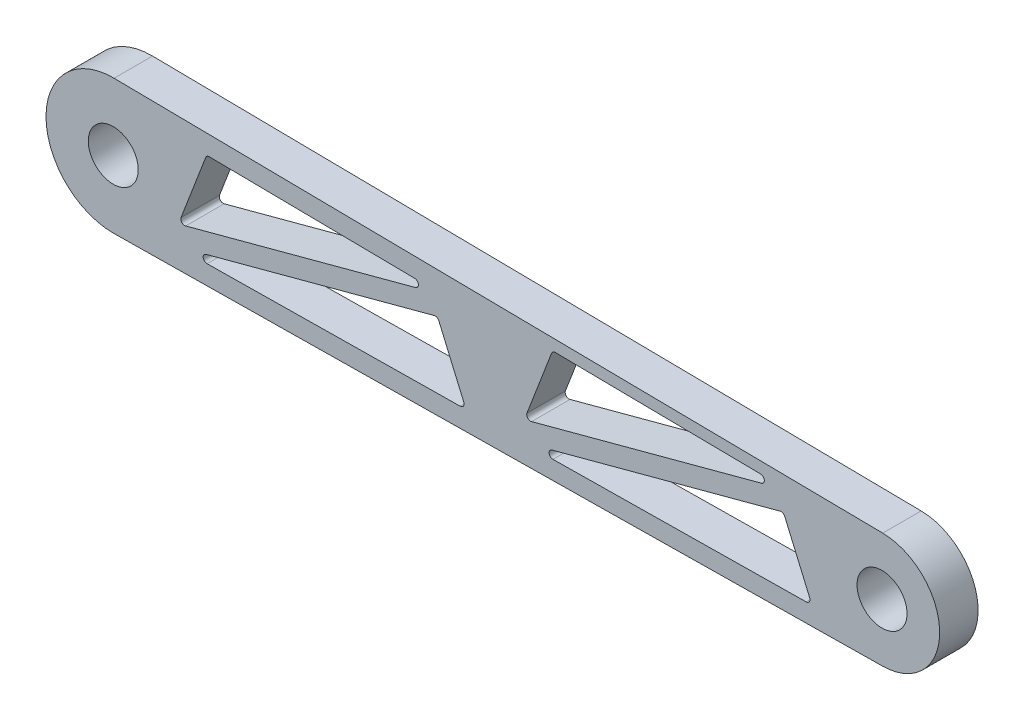
ISO-10303-21;
HEADER;
FILE_DESCRIPTION(('STEP AP214'),'2;1');
FILE_NAME('part.step','',(''),(''),'','','');
FILE_SCHEMA(('AUTOMOTIVE_DESIGN { 1 0 10303 214 1 1 1 1 }'));
ENDSEC;
DATA;
#1=APPLICATION_CONTEXT('core data for automotive mechanical design processes');
#2=APPLICATION_PROTOCOL_DEFINITION('international standard','automotive_design',2000,#1);
#3=PRODUCT_CONTEXT('',#1,'mechanical');
#4=PRODUCT('Part','Part','',(#3));
#5=PRODUCT_RELATED_PRODUCT_CATEGORY('part','',(#4));
#6=PRODUCT_DEFINITION_FORMATION('','',#4);
#7=PRODUCT_DEFINITION_CONTEXT('part definition',#1,'design');
#8=PRODUCT_DEFINITION('design','',#6,#7);
#9=PRODUCT_DEFINITION_SHAPE('','',#8);
#10=(LENGTH_UNIT() NAMED_UNIT(*) SI_UNIT(.MILLI.,.METRE.));
#11=(NAMED_UNIT(*) PLANE_ANGLE_UNIT() SI_UNIT($,.RADIAN.));
#12=(NAMED_UNIT(*) SI_UNIT($,.STERADIAN.) SOLID_ANGLE_UNIT());
#13=UNCERTAINTY_MEASURE_WITH_UNIT(LENGTH_MEASURE(1.E-05),#10,'distance_accuracy_value','');
#14=(GEOMETRIC_REPRESENTATION_CONTEXT(3) GLOBAL_UNCERTAINTY_ASSIGNED_CONTEXT((#13)) GLOBAL_UNIT_ASSIGNED_CONTEXT((#10,
#11,#12)) REPRESENTATION_CONTEXT('',''));
#15=CARTESIAN_POINT('',(0.,0.,0.));
#16=DIRECTION('',(0.,0.,1.));
#17=DIRECTION('',(1.,0.,0.));
#18=AXIS2_PLACEMENT_3D('',#15,#16,#17);
#19=CARTESIAN_POINT('',(0.,0.,10.));
#20=DIRECTION('',(0.,0.,1.));
#21=DIRECTION('',(1.,0.,0.));
#22=AXIS2_PLACEMENT_3D('',#19,#20,#21);
#23=PLANE('',#22);
#24=CARTESIAN_POINT('',(200.,0.,10.));
#25=DIRECTION('',(0.,0.,1.));
#26=DIRECTION('',(1.,0.,0.));
#27=AXIS2_PLACEMENT_3D('',#24,#25,#26);
#28=CIRCLE('',#27,6.50000000000002);
#29=CARTESIAN_POINT('',(206.5,0.,10.));
#30=VERTEX_POINT('',#29);
#31=EDGE_CURVE('E529',#30,#30,#28,.T.);
#32=ORIENTED_EDGE('',*,*,#31,.F.);
#33=EDGE_LOOP('',(#32));
#34=FACE_BOUND('',#33,.T.);
#35=CARTESIAN_POINT('',(0.,0.,10.));
#36=DIRECTION('',(0.,0.,1.));
#37=DIRECTION('',(1.,0.,0.));
#38=AXIS2_PLACEMENT_3D('',#35,#36,#37);
#39=CIRCLE('',#38,6.5);
#40=CARTESIAN_POINT('',(6.5,0.,10.));
#41=VERTEX_POINT('',#40);
#42=EDGE_CURVE('E421',#41,#41,#39,.T.);
#43=ORIENTED_EDGE('',*,*,#42,.F.);
#44=EDGE_LOOP('',(#43));
#45=FACE_BOUND('',#44,.T.);
#46=DIRECTION('',(0.999921871948004,0.0125000000000001,0.));
#47=VECTOR('',#46,1.);
#48=CARTESIAN_POINT('',(0.218750000000001,-17.4986327590901,10.));
#49=LINE('',#48,#47);
#50=CARTESIAN_POINT('',(0.21875,-17.4986327590901,10.));
#51=VERTEX_POINT('',#50);
#52=CARTESIAN_POINT('',(200.1875,-14.9988280792201,10.));
#53=VERTEX_POINT('',#52);
#54=EDGE_CURVE('E270',#51,#53,#49,.T.);
#55=ORIENTED_EDGE('',*,*,#54,.T.);
#56=CARTESIAN_POINT('',(200.,0.,10.));
#57=DIRECTION('',(0.,0.,1.));
#58=DIRECTION('',(1.,0.,0.));
#59=AXIS2_PLACEMENT_3D('',#56,#57,#58);
#60=CIRCLE('',#59,15.);
#61=CARTESIAN_POINT('',(200.1875,14.9988280792201,10.));
#62=VERTEX_POINT('',#61);
#63=EDGE_CURVE('E258',#53,#62,#60,.T.);
#64=ORIENTED_EDGE('',*,*,#63,.T.);
#65=DIRECTION('',(0.999921871948004,-0.0125000000000001,0.));
#66=VECTOR('',#65,1.);
#67=CARTESIAN_POINT('',(0.218750000000001,17.4986327590901,10.));
#68=LINE('',#67,#66);
#69=CARTESIAN_POINT('',(0.21875,17.4986327590901,10.));
#70=VERTEX_POINT('',#69);
#71=EDGE_CURVE('E269',#70,#62,#68,.T.);
#72=ORIENTED_EDGE('',*,*,#71,.F.);
#73=CARTESIAN_POINT('',(0.,0.,10.));
#74=DIRECTION('',(0.,0.,1.));
#75=DIRECTION('',(1.,0.,0.));
#76=AXIS2_PLACEMENT_3D('',#73,#74,#75);
#77=CIRCLE('',#76,17.5);
#78=EDGE_CURVE('E275',#70,#51,#77,.T.);
#79=ORIENTED_EDGE('',*,*,#78,.T.);
#80=EDGE_LOOP('',(#55,#64,#72,#79));
#81=FACE_BOUND('',#80,.T.);
#82=DIRECTION('',(0.357957296208025,0.933737957936508,0.));
#83=VECTOR('',#82,1.);
#84=CARTESIAN_POINT('',(16.9374080942747,-6.97942253213254,10.));
#85=LINE('',#84,#83);
#86=CARTESIAN_POINT('',(17.63950906089,-5.14797970423813,10.));
#87=VERTEX_POINT('',#86);
#88=CARTESIAN_POINT('',(24.039559429745,11.5466652308173,10.));
#89=VERTEX_POINT('',#88);
#90=EDGE_CURVE('E395',#87,#89,#85,.T.);
#91=ORIENTED_EDGE('',*,*,#90,.T.);
#92=CARTESIAN_POINT('',(24.9732973876815,11.1887079346093,10.));
#93=DIRECTION('',(0.,0.,1.));
#94=DIRECTION('',(1.,0.,0.));
#95=AXIS2_PLACEMENT_3D('',#92,#93,#94);
#96=CIRCLE('',#95,1.);
#97=CARTESIAN_POINT('',(24.9857973876815,12.1886298065573,10.));
#98=VERTEX_POINT('',#97);
#99=EDGE_CURVE('E384',#89,#98,#96,.F.);
#100=ORIENTED_EDGE('',*,*,#99,.T.);
#101=DIRECTION('',(0.999921871948004,-0.0125,0.));
#102=VECTOR('',#101,1.);
#103=CARTESIAN_POINT('',(24.2890019345979,12.1973404302649,10.));
#104=LINE('',#103,#102);
#105=CARTESIAN_POINT('',(78.4117048682753,11.5207537831972,10.));
#106=VERTEX_POINT('',#105);
#107=EDGE_CURVE('E404',#98,#106,#104,.T.);
#108=ORIENTED_EDGE('',*,*,#107,.T.);
#109=CARTESIAN_POINT('',(78.3992048682752,10.5208319112492,10.));
#110=DIRECTION('',(0.,0.,1.));
#111=DIRECTION('',(1.,0.,0.));
#112=AXIS2_PLACEMENT_3D('',#109,#110,#111);
#113=CIRCLE('',#112,1.);
#114=CARTESIAN_POINT('',(78.6579704622301,9.55489176435331,10.));
#115=VERTEX_POINT('',#114);
#116=EDGE_CURVE('E388',#106,#115,#113,.F.);
#117=ORIENTED_EDGE('',*,*,#116,.T.);
#118=DIRECTION('',(-0.965940146895865,-0.258765593954828,0.));
#119=VECTOR('',#118,1.);
#120=CARTESIAN_POINT('',(85.6581396306623,11.4301662712415,10.));
#121=LINE('',#120,#119);
#122=CARTESIAN_POINT('',(18.8320126127814,-6.47187714734202,10.));
#123=VERTEX_POINT('',#122);
#124=EDGE_CURVE('E396',#115,#123,#121,.T.);
#125=ORIENTED_EDGE('',*,*,#124,.T.);
#126=CARTESIAN_POINT('',(18.5732470188266,-5.50593700044615,10.));
#127=DIRECTION('',(0.,0.,1.));
#128=DIRECTION('',(1.,0.,0.));
#129=AXIS2_PLACEMENT_3D('',#126,#127,#128);
#130=CIRCLE('',#129,1.);
#131=EDGE_CURVE('E81',#123,#87,#130,.F.);
#132=ORIENTED_EDGE('',*,*,#131,.T.);
#133=EDGE_LOOP('',(#91,#100,#108,#117,#125,#132));
#134=FACE_BOUND('',#133,.T.);
#135=DIRECTION('',(-0.999921871948004,-0.0125000000000001,0.));
#136=VECTOR('',#135,1.);
#137=CARTESIAN_POINT('',(181.776483203951,-10.438596908555,10.));
#138=LINE('',#137,#136);
#139=CARTESIAN_POINT('',(180.277349255383,-10.4573375470817,10.));
#140=VERTEX_POINT('',#139);
#141=CARTESIAN_POINT('',(114.392029084728,-11.2809683978888,10.));
#142=VERTEX_POINT('',#141);
#143=EDGE_CURVE('E537',#140,#142,#138,.T.);
#144=ORIENTED_EDGE('',*,*,#143,.T.);
#145=CARTESIAN_POINT('',(114.379529084728,-10.2810465259408,10.));
#146=DIRECTION('',(0.,0.,1.));
#147=DIRECTION('',(1.,0.,0.));
#148=AXIS2_PLACEMENT_3D('',#145,#146,#147);
#149=CIRCLE('',#148,1.);
#150=CARTESIAN_POINT('',(114.120763490774,-9.31510637904495,10.));
#151=VERTEX_POINT('',#150);
#152=EDGE_CURVE('E360',#142,#151,#149,.F.);
#153=ORIENTED_EDGE('',*,*,#152,.T.);
#154=DIRECTION('',(0.965940146895865,0.258765593954827,0.));
#155=VECTOR('',#154,1.);
#156=CARTESIAN_POINT('',(106.409962250681,-11.3807520292151,10.));
#157=LINE('',#156,#155);
#158=CARTESIAN_POINT('',(173.506365503904,6.59369565871651,10.));
#159=VERTEX_POINT('',#158);
#160=EDGE_CURVE('E534',#151,#159,#157,.T.);
#161=ORIENTED_EDGE('',*,*,#160,.T.);
#162=CARTESIAN_POINT('',(173.765131097858,5.62775551182065,10.));
#163=DIRECTION('',(0.,0.,1.));
#164=DIRECTION('',(1.,0.,0.));
#165=AXIS2_PLACEMENT_3D('',#162,#163,#164);
#166=CIRCLE('',#165,1.);
#167=CARTESIAN_POINT('',(174.683510738537,6.02345594849749,10.));
#168=VERTEX_POINT('',#167);
#169=EDGE_CURVE('E348',#159,#168,#166,.F.);
#170=ORIENTED_EDGE('',*,*,#169,.T.);
#171=DIRECTION('',(0.395700436676833,-0.91837964067904,0.));
#172=VECTOR('',#171,1.);
#173=CARTESIAN_POINT('',(174.341425691282,6.81739983549119,10.));
#174=LINE('',#173,#172);
#175=CARTESIAN_POINT('',(181.183228896062,-9.06171523845684,10.));
#176=VERTEX_POINT('',#175);
#177=EDGE_CURVE('E541',#168,#176,#174,.T.);
#178=ORIENTED_EDGE('',*,*,#177,.T.);
#179=CARTESIAN_POINT('',(180.264849255383,-9.45741567513368,10.));
#180=DIRECTION('',(0.,0.,1.));
#181=DIRECTION('',(1.,0.,0.));
#182=AXIS2_PLACEMENT_3D('',#179,#180,#181);
#183=CIRCLE('',#182,1.);
#184=EDGE_CURVE('E352',#176,#140,#183,.F.);
#185=ORIENTED_EDGE('',*,*,#184,.T.);
#186=EDGE_LOOP('',(#144,#153,#161,#170,#178,#185));
#187=FACE_BOUND('',#186,.T.);
#188=DIRECTION('',(0.357957296208025,0.933737957936508,0.));
#189=VECTOR('',#188,1.);
#190=CARTESIAN_POINT('',(106.932756460314,-6.06439658972499,10.));
#191=LINE('',#190,#189);
#192=CARTESIAN_POINT('',(107.634857426929,-4.23295376183056,10.));
#193=VERTEX_POINT('',#192);
#194=CARTESIAN_POINT('',(114.034907795784,12.4616911732249,10.));
#195=VERTEX_POINT('',#194);
#196=EDGE_CURVE('E573',#193,#195,#191,.T.);
#197=ORIENTED_EDGE('',*,*,#196,.T.);
#198=CARTESIAN_POINT('',(114.968645753721,12.1037338770168,10.));
#199=DIRECTION('',(0.,0.,1.));
#200=DIRECTION('',(1.,0.,0.));
#201=AXIS2_PLACEMENT_3D('',#198,#199,#200);
#202=CIRCLE('',#201,1.);
#203=CARTESIAN_POINT('',(114.981145753721,13.1036557489648,10.));
#204=VERTEX_POINT('',#203);
#205=EDGE_CURVE('E368',#195,#204,#202,.F.);
#206=ORIENTED_EDGE('',*,*,#205,.T.);
#207=DIRECTION('',(0.999921871948004,-0.0125,0.));
#208=VECTOR('',#207,1.);
#209=CARTESIAN_POINT('',(114.284350300637,13.1123663726724,10.));
#210=LINE('',#209,#208);
#211=CARTESIAN_POINT('',(168.407053234314,12.4357797256047,10.));
#212=VERTEX_POINT('',#211);
#213=EDGE_CURVE('E570',#204,#212,#210,.T.);
#214=ORIENTED_EDGE('',*,*,#213,.T.);
#215=CARTESIAN_POINT('',(168.394553234314,11.4358578536567,10.));
#216=DIRECTION('',(0.,0.,1.));
#217=DIRECTION('',(1.,0.,0.));
#218=AXIS2_PLACEMENT_3D('',#215,#216,#217);
#219=CIRCLE('',#218,1.);
#220=CARTESIAN_POINT('',(168.653318828269,10.4699177067609,10.));
#221=VERTEX_POINT('',#220);
#222=EDGE_CURVE('E356',#212,#221,#219,.F.);
#223=ORIENTED_EDGE('',*,*,#222,.T.);
#224=DIRECTION('',(-0.965940146895865,-0.258765593954828,0.));
#225=VECTOR('',#224,1.);
#226=CARTESIAN_POINT('',(175.653487996701,12.3451922136491,10.));
#227=LINE('',#226,#225);
#228=CARTESIAN_POINT('',(108.82736097882,-5.55685120493446,10.));
#229=VERTEX_POINT('',#228);
#230=EDGE_CURVE('E565',#221,#229,#227,.T.);
#231=ORIENTED_EDGE('',*,*,#230,.T.);
#232=CARTESIAN_POINT('',(108.568595384866,-4.59091105803859,10.));
#233=DIRECTION('',(0.,0.,1.));
#234=DIRECTION('',(1.,0.,0.));
#235=AXIS2_PLACEMENT_3D('',#232,#233,#234);
#236=CIRCLE('',#235,1.);
#237=EDGE_CURVE('E364',#229,#193,#236,.F.);
#238=ORIENTED_EDGE('',*,*,#237,.T.);
#239=EDGE_LOOP('',(#197,#206,#214,#223,#231,#238));
#240=FACE_BOUND('',#239,.T.);
#241=DIRECTION('',(-0.999921871948004,-0.0125000000000001,0.));
#242=VECTOR('',#241,1.);
#243=CARTESIAN_POINT('',(91.7811348379119,-11.3536228509626,10.));
#244=LINE('',#243,#242);
#245=CARTESIAN_POINT('',(90.2820008893441,-11.3723634894892,10.));
#246=VERTEX_POINT('',#245);
#247=CARTESIAN_POINT('',(24.3966807186895,-12.1959943402964,10.));
#248=VERTEX_POINT('',#247);
#249=EDGE_CURVE('E555',#246,#248,#244,.T.);
#250=ORIENTED_EDGE('',*,*,#249,.T.);
#251=CARTESIAN_POINT('',(24.3841807186895,-11.1960724683484,10.));
#252=DIRECTION('',(0.,0.,1.));
#253=DIRECTION('',(1.,0.,0.));
#254=AXIS2_PLACEMENT_3D('',#251,#252,#253);
#255=CIRCLE('',#254,1.);
#256=CARTESIAN_POINT('',(24.1254151247346,-10.2301323214525,10.));
#257=VERTEX_POINT('',#256);
#258=EDGE_CURVE('E380',#248,#257,#255,.F.);
#259=ORIENTED_EDGE('',*,*,#258,.T.);
#260=DIRECTION('',(0.965940146895865,0.258765593954827,0.));
#261=VECTOR('',#260,1.);
#262=CARTESIAN_POINT('',(16.4146138846419,-12.2957779716227,10.));
#263=LINE('',#262,#261);
#264=CARTESIAN_POINT('',(83.5110171378645,5.67866971630896,10.));
#265=VERTEX_POINT('',#264);
#266=EDGE_CURVE('E552',#257,#265,#263,.T.);
#267=ORIENTED_EDGE('',*,*,#266,.T.);
#268=CARTESIAN_POINT('',(83.7697827318193,4.71272956941309,10.));
#269=DIRECTION('',(0.,0.,1.));
#270=DIRECTION('',(1.,0.,0.));
#271=AXIS2_PLACEMENT_3D('',#268,#269,#270);
#272=CIRCLE('',#271,1.);
#273=CARTESIAN_POINT('',(84.6881623724984,5.10843000608992,10.));
#274=VERTEX_POINT('',#273);
#275=EDGE_CURVE('E372',#265,#274,#272,.F.);
#276=ORIENTED_EDGE('',*,*,#275,.T.);
#277=DIRECTION('',(0.395700436676834,-0.91837964067904,0.));
#278=VECTOR('',#277,1.);
#279=CARTESIAN_POINT('',(84.3460773252427,5.90237389308364,10.));
#280=LINE('',#279,#278);
#281=CARTESIAN_POINT('',(91.1878805300231,-9.9767411808644,10.));
#282=VERTEX_POINT('',#281);
#283=EDGE_CURVE('E422',#274,#282,#280,.T.);
#284=ORIENTED_EDGE('',*,*,#283,.T.);
#285=CARTESIAN_POINT('',(90.2695008893441,-10.3724416175412,10.));
#286=DIRECTION('',(0.,0.,1.));
#287=DIRECTION('',(1.,0.,0.));
#288=AXIS2_PLACEMENT_3D('',#285,#286,#287);
#289=CIRCLE('',#288,1.);
#290=EDGE_CURVE('E376',#282,#246,#289,.F.);
#291=ORIENTED_EDGE('',*,*,#290,.T.);
#292=EDGE_LOOP('',(#250,#259,#267,#276,#284,#291));
#293=FACE_BOUND('',#292,.T.);
#294=ADVANCED_FACE('F73',(#34,#45,#81,#134,#187,#240,#293),#23,.T.);
#295=CARTESIAN_POINT('',(0.,0.,0.));
#296=DIRECTION('',(0.,0.,1.));
#297=DIRECTION('',(1.,0.,0.));
#298=AXIS2_PLACEMENT_3D('',#295,#296,#297);
#299=PLANE('',#298);
#300=CARTESIAN_POINT('',(200.,0.,0.));
#301=DIRECTION('',(0.,0.,1.));
#302=DIRECTION('',(1.,0.,0.));
#303=AXIS2_PLACEMENT_3D('',#300,#301,#302);
#304=CIRCLE('',#303,6.50000000000002);
#305=CARTESIAN_POINT('',(206.5,0.,0.));
#306=VERTEX_POINT('',#305);
#307=EDGE_CURVE('E527',#306,#306,#304,.T.);
#308=ORIENTED_EDGE('',*,*,#307,.T.);
#309=EDGE_LOOP('',(#308));
#310=FACE_BOUND('',#309,.T.);
#311=DIRECTION('',(-0.965940146895865,-0.258765593954828,0.));
#312=VECTOR('',#311,1.);
#313=CARTESIAN_POINT('',(175.653487996701,12.3451922136491,0.));
#314=LINE('',#313,#312);
#315=CARTESIAN_POINT('',(168.653318828269,10.4699177067609,0.));
#316=VERTEX_POINT('',#315);
#317=CARTESIAN_POINT('',(108.82736097882,-5.55685120493446,0.));
#318=VERTEX_POINT('',#317);
#319=EDGE_CURVE('E416',#316,#318,#314,.T.);
#320=ORIENTED_EDGE('',*,*,#319,.F.);
#321=CARTESIAN_POINT('',(168.394553234314,11.4358578536567,0.));
#322=DIRECTION('',(0.,0.,1.));
#323=DIRECTION('',(1.,0.,0.));
#324=AXIS2_PLACEMENT_3D('',#321,#322,#323);
#325=CIRCLE('',#324,1.);
#326=CARTESIAN_POINT('',(168.407053234314,12.4357797256047,0.));
#327=VERTEX_POINT('',#326);
#328=EDGE_CURVE('E358',#316,#327,#325,.T.);
#329=ORIENTED_EDGE('',*,*,#328,.T.);
#330=DIRECTION('',(0.999921871948004,-0.0125,0.));
#331=VECTOR('',#330,1.);
#332=CARTESIAN_POINT('',(114.284350300637,13.1123663726724,0.));
#333=LINE('',#332,#331);
#334=CARTESIAN_POINT('',(114.981145753721,13.1036557489648,0.));
#335=VERTEX_POINT('',#334);
#336=EDGE_CURVE('E544',#335,#327,#333,.T.);
#337=ORIENTED_EDGE('',*,*,#336,.F.);
#338=CARTESIAN_POINT('',(114.968645753721,12.1037338770168,0.));
#339=DIRECTION('',(0.,0.,1.));
#340=DIRECTION('',(1.,0.,0.));
#341=AXIS2_PLACEMENT_3D('',#338,#339,#340);
#342=CIRCLE('',#341,1.);
#343=CARTESIAN_POINT('',(114.034907795784,12.4616911732249,0.));
#344=VERTEX_POINT('',#343);
#345=EDGE_CURVE('E370',#335,#344,#342,.T.);
#346=ORIENTED_EDGE('',*,*,#345,.T.);
#347=DIRECTION('',(0.357957296208025,0.933737957936508,0.));
#348=VECTOR('',#347,1.);
#349=CARTESIAN_POINT('',(106.932756460314,-6.06439658972499,0.));
#350=LINE('',#349,#348);
#351=CARTESIAN_POINT('',(107.634857426929,-4.23295376183056,0.));
#352=VERTEX_POINT('',#351);
#353=EDGE_CURVE('E579',#352,#344,#350,.T.);
#354=ORIENTED_EDGE('',*,*,#353,.F.);
#355=CARTESIAN_POINT('',(108.568595384866,-4.59091105803859,0.));
#356=DIRECTION('',(0.,0.,1.));
#357=DIRECTION('',(1.,0.,0.));
#358=AXIS2_PLACEMENT_3D('',#355,#356,#357);
#359=CIRCLE('',#358,1.);
#360=EDGE_CURVE('E366',#352,#318,#359,.T.);
#361=ORIENTED_EDGE('',*,*,#360,.T.);
#362=EDGE_LOOP('',(#320,#329,#337,#346,#354,#361));
#363=FACE_BOUND('',#362,.T.);
#364=DIRECTION('',(-0.965940146895865,-0.258765593954828,0.));
#365=VECTOR('',#364,1.);
#366=CARTESIAN_POINT('',(85.6581396306623,11.4301662712415,0.));
#367=LINE('',#366,#365);
#368=CARTESIAN_POINT('',(78.6579704622301,9.55489176435331,0.));
#369=VERTEX_POINT('',#368);
#370=CARTESIAN_POINT('',(18.8320126127814,-6.47187714734202,0.));
#371=VERTEX_POINT('',#370);
#372=EDGE_CURVE('E407',#369,#371,#367,.T.);
#373=ORIENTED_EDGE('',*,*,#372,.F.);
#374=CARTESIAN_POINT('',(78.3992048682752,10.5208319112492,0.));
#375=DIRECTION('',(0.,0.,1.));
#376=DIRECTION('',(1.,0.,0.));
#377=AXIS2_PLACEMENT_3D('',#374,#375,#376);
#378=CIRCLE('',#377,1.);
#379=CARTESIAN_POINT('',(78.4117048682753,11.5207537831972,0.));
#380=VERTEX_POINT('',#379);
#381=EDGE_CURVE('E390',#369,#380,#378,.T.);
#382=ORIENTED_EDGE('',*,*,#381,.T.);
#383=DIRECTION('',(0.999921871948004,-0.0125,0.));
#384=VECTOR('',#383,1.);
#385=CARTESIAN_POINT('',(24.2890019345979,12.1973404302649,0.));
#386=LINE('',#385,#384);
#387=CARTESIAN_POINT('',(24.9857973876815,12.1886298065573,0.));
#388=VERTEX_POINT('',#387);
#389=EDGE_CURVE('E411',#388,#380,#386,.T.);
#390=ORIENTED_EDGE('',*,*,#389,.F.);
#391=CARTESIAN_POINT('',(24.9732973876815,11.1887079346093,0.));
#392=DIRECTION('',(0.,0.,1.));
#393=DIRECTION('',(1.,0.,0.));
#394=AXIS2_PLACEMENT_3D('',#391,#392,#393);
#395=CIRCLE('',#394,1.);
#396=CARTESIAN_POINT('',(24.039559429745,11.5466652308173,0.));
#397=VERTEX_POINT('',#396);
#398=EDGE_CURVE('E386',#388,#397,#395,.T.);
#399=ORIENTED_EDGE('',*,*,#398,.T.);
#400=DIRECTION('',(0.357957296208025,0.933737957936508,0.));
#401=VECTOR('',#400,1.);
#402=CARTESIAN_POINT('',(16.9374080942747,-6.97942253213254,0.));
#403=LINE('',#402,#401);
#404=CARTESIAN_POINT('',(17.63950906089,-5.14797970423813,0.));
#405=VERTEX_POINT('',#404);
#406=EDGE_CURVE('E409',#405,#397,#403,.T.);
#407=ORIENTED_EDGE('',*,*,#406,.F.);
#408=CARTESIAN_POINT('',(18.5732470188266,-5.50593700044615,0.));
#409=DIRECTION('',(0.,0.,1.));
#410=DIRECTION('',(1.,0.,0.));
#411=AXIS2_PLACEMENT_3D('',#408,#409,#410);
#412=CIRCLE('',#411,1.);
#413=EDGE_CURVE('E12',#405,#371,#412,.T.);
#414=ORIENTED_EDGE('',*,*,#413,.T.);
#415=EDGE_LOOP('',(#373,#382,#390,#399,#407,#414));
#416=FACE_BOUND('',#415,.T.);
#417=CARTESIAN_POINT('',(0.,0.,0.));
#418=DIRECTION('',(0.,0.,1.));
#419=DIRECTION('',(1.,0.,0.));
#420=AXIS2_PLACEMENT_3D('',#417,#418,#419);
#421=CIRCLE('',#420,6.5);
#422=CARTESIAN_POINT('',(6.5,0.,0.));
#423=VERTEX_POINT('',#422);
#424=EDGE_CURVE('E424',#423,#423,#421,.T.);
#425=ORIENTED_EDGE('',*,*,#424,.T.);
#426=EDGE_LOOP('',(#425));
#427=FACE_BOUND('',#426,.T.);
#428=DIRECTION('',(0.999921871948004,0.0125000000000001,0.));
#429=VECTOR('',#428,1.);
#430=CARTESIAN_POINT('',(0.218750000000001,-17.4986327590901,0.));
#431=LINE('',#430,#429);
#432=CARTESIAN_POINT('',(0.21875,-17.4986327590901,0.));
#433=VERTEX_POINT('',#432);
#434=CARTESIAN_POINT('',(200.1875,-14.9988280792201,0.));
#435=VERTEX_POINT('',#434);
#436=EDGE_CURVE('E283',#433,#435,#431,.T.);
#437=ORIENTED_EDGE('',*,*,#436,.F.);
#438=CARTESIAN_POINT('',(0.,0.,0.));
#439=DIRECTION('',(0.,0.,1.));
#440=DIRECTION('',(1.,0.,0.));
#441=AXIS2_PLACEMENT_3D('',#438,#439,#440);
#442=CIRCLE('',#441,17.5);
#443=CARTESIAN_POINT('',(0.21875,17.4986327590901,0.));
#444=VERTEX_POINT('',#443);
#445=EDGE_CURVE('E279',#444,#433,#442,.T.);
#446=ORIENTED_EDGE('',*,*,#445,.F.);
#447=DIRECTION('',(0.999921871948004,-0.0125000000000001,0.));
#448=VECTOR('',#447,1.);
#449=CARTESIAN_POINT('',(0.218750000000001,17.4986327590901,0.));
#450=LINE('',#449,#448);
#451=CARTESIAN_POINT('',(200.1875,14.9988280792201,0.));
#452=VERTEX_POINT('',#451);
#453=EDGE_CURVE('E435',#444,#452,#450,.T.);
#454=ORIENTED_EDGE('',*,*,#453,.T.);
#455=CARTESIAN_POINT('',(200.,0.,0.));
#456=DIRECTION('',(0.,0.,1.));
#457=DIRECTION('',(1.,0.,0.));
#458=AXIS2_PLACEMENT_3D('',#455,#456,#457);
#459=CIRCLE('',#458,15.);
#460=EDGE_CURVE('E433',#435,#452,#459,.T.);
#461=ORIENTED_EDGE('',*,*,#460,.F.);
#462=EDGE_LOOP('',(#437,#446,#454,#461));
#463=FACE_BOUND('',#462,.T.);
#464=DIRECTION('',(0.395700436676833,-0.91837964067904,0.));
#465=VECTOR('',#464,1.);
#466=CARTESIAN_POINT('',(174.341425691282,6.81739983549119,0.));
#467=LINE('',#466,#465);
#468=CARTESIAN_POINT('',(174.683510738537,6.02345594849749,0.));
#469=VERTEX_POINT('',#468);
#470=CARTESIAN_POINT('',(181.183228896062,-9.06171523845684,0.));
#471=VERTEX_POINT('',#470);
#472=EDGE_CURVE('E538',#469,#471,#467,.T.);
#473=ORIENTED_EDGE('',*,*,#472,.F.);
#474=CARTESIAN_POINT('',(173.765131097858,5.62775551182065,0.));
#475=DIRECTION('',(0.,0.,1.));
#476=DIRECTION('',(1.,0.,0.));
#477=AXIS2_PLACEMENT_3D('',#474,#475,#476);
#478=CIRCLE('',#477,1.);
#479=CARTESIAN_POINT('',(173.506365503904,6.59369565871651,0.));
#480=VERTEX_POINT('',#479);
#481=EDGE_CURVE('E350',#469,#480,#478,.T.);
#482=ORIENTED_EDGE('',*,*,#481,.T.);
#483=DIRECTION('',(0.965940146895865,0.258765593954827,0.));
#484=VECTOR('',#483,1.);
#485=CARTESIAN_POINT('',(106.409962250681,-11.3807520292151,0.));
#486=LINE('',#485,#484);
#487=CARTESIAN_POINT('',(114.120763490774,-9.31510637904495,0.));
#488=VERTEX_POINT('',#487);
#489=EDGE_CURVE('E531',#488,#480,#486,.T.);
#490=ORIENTED_EDGE('',*,*,#489,.F.);
#491=CARTESIAN_POINT('',(114.379529084728,-10.2810465259408,0.));
#492=DIRECTION('',(0.,0.,1.));
#493=DIRECTION('',(1.,0.,0.));
#494=AXIS2_PLACEMENT_3D('',#491,#492,#493);
#495=CIRCLE('',#494,1.);
#496=CARTESIAN_POINT('',(114.392029084728,-11.2809683978888,0.));
#497=VERTEX_POINT('',#496);
#498=EDGE_CURVE('E362',#488,#497,#495,.T.);
#499=ORIENTED_EDGE('',*,*,#498,.T.);
#500=DIRECTION('',(-0.999921871948004,-0.0125000000000001,0.));
#501=VECTOR('',#500,1.);
#502=CARTESIAN_POINT('',(181.776483203951,-10.438596908555,0.));
#503=LINE('',#502,#501);
#504=CARTESIAN_POINT('',(180.277349255383,-10.4573375470817,0.));
#505=VERTEX_POINT('',#504);
#506=EDGE_CURVE('E547',#505,#497,#503,.T.);
#507=ORIENTED_EDGE('',*,*,#506,.F.);
#508=CARTESIAN_POINT('',(180.264849255383,-9.45741567513368,0.));
#509=DIRECTION('',(0.,0.,1.));
#510=DIRECTION('',(1.,0.,0.));
#511=AXIS2_PLACEMENT_3D('',#508,#509,#510);
#512=CIRCLE('',#511,1.);
#513=EDGE_CURVE('E354',#505,#471,#512,.T.);
#514=ORIENTED_EDGE('',*,*,#513,.T.);
#515=EDGE_LOOP('',(#473,#482,#490,#499,#507,#514));
#516=FACE_BOUND('',#515,.T.);
#517=DIRECTION('',(0.395700436676834,-0.91837964067904,0.));
#518=VECTOR('',#517,1.);
#519=CARTESIAN_POINT('',(84.3460773252427,5.90237389308364,0.));
#520=LINE('',#519,#518);
#521=CARTESIAN_POINT('',(84.6881623724984,5.10843000608992,0.));
#522=VERTEX_POINT('',#521);
#523=CARTESIAN_POINT('',(91.1878805300231,-9.9767411808644,0.));
#524=VERTEX_POINT('',#523);
#525=EDGE_CURVE('E556',#522,#524,#520,.T.);
#526=ORIENTED_EDGE('',*,*,#525,.F.);
#527=CARTESIAN_POINT('',(83.7697827318193,4.71272956941309,0.));
#528=DIRECTION('',(0.,0.,1.));
#529=DIRECTION('',(1.,0.,0.));
#530=AXIS2_PLACEMENT_3D('',#527,#528,#529);
#531=CIRCLE('',#530,1.);
#532=CARTESIAN_POINT('',(83.5110171378645,5.67866971630896,0.));
#533=VERTEX_POINT('',#532);
#534=EDGE_CURVE('E374',#522,#533,#531,.T.);
#535=ORIENTED_EDGE('',*,*,#534,.T.);
#536=DIRECTION('',(0.965940146895865,0.258765593954827,0.));
#537=VECTOR('',#536,1.);
#538=CARTESIAN_POINT('',(16.4146138846419,-12.2957779716227,0.));
#539=LINE('',#538,#537);
#540=CARTESIAN_POINT('',(24.1254151247346,-10.2301323214525,0.));
#541=VERTEX_POINT('',#540);
#542=EDGE_CURVE('E561',#541,#533,#539,.T.);
#543=ORIENTED_EDGE('',*,*,#542,.F.);
#544=CARTESIAN_POINT('',(24.3841807186895,-11.1960724683484,0.));
#545=DIRECTION('',(0.,0.,1.));
#546=DIRECTION('',(1.,0.,0.));
#547=AXIS2_PLACEMENT_3D('',#544,#545,#546);
#548=CIRCLE('',#547,1.);
#549=CARTESIAN_POINT('',(24.3966807186895,-12.1959943402964,0.));
#550=VERTEX_POINT('',#549);
#551=EDGE_CURVE('E382',#541,#550,#548,.T.);
#552=ORIENTED_EDGE('',*,*,#551,.T.);
#553=DIRECTION('',(-0.999921871948004,-0.0125000000000001,0.));
#554=VECTOR('',#553,1.);
#555=CARTESIAN_POINT('',(91.7811348379119,-11.3536228509626,0.));
#556=LINE('',#555,#554);
#557=CARTESIAN_POINT('',(90.2820008893441,-11.3723634894892,0.));
#558=VERTEX_POINT('',#557);
#559=EDGE_CURVE('E564',#558,#550,#556,.T.);
#560=ORIENTED_EDGE('',*,*,#559,.F.);
#561=CARTESIAN_POINT('',(90.2695008893441,-10.3724416175412,0.));
#562=DIRECTION('',(0.,0.,1.));
#563=DIRECTION('',(1.,0.,0.));
#564=AXIS2_PLACEMENT_3D('',#561,#562,#563);
#565=CIRCLE('',#564,1.);
#566=EDGE_CURVE('E378',#558,#524,#565,.T.);
#567=ORIENTED_EDGE('',*,*,#566,.T.);
#568=EDGE_LOOP('',(#526,#535,#543,#552,#560,#567));
#569=FACE_BOUND('',#568,.T.);
#570=ADVANCED_FACE('F445',(#310,#363,#416,#427,#463,#516,#569),#299,.F.);
#571=CARTESIAN_POINT('',(0.218750000000001,-17.4986327590901,10.));
#572=DIRECTION('',(-0.0125,0.999921871948004,0.));
#573=DIRECTION('',(-0.999921871948004,-0.0125,0.));
#574=AXIS2_PLACEMENT_3D('',#571,#572,#573);
#575=PLANE('',#574);
#576=ORIENTED_EDGE('',*,*,#436,.T.);
#577=DIRECTION('',(0.,0.,-1.));
#578=VECTOR('',#577,1.);
#579=CARTESIAN_POINT('',(200.1875,-14.9988280792201,10.));
#580=LINE('',#579,#578);
#581=EDGE_CURVE('E263',#53,#435,#580,.T.);
#582=ORIENTED_EDGE('',*,*,#581,.F.);
#583=ORIENTED_EDGE('',*,*,#54,.F.);
#584=DIRECTION('',(0.,0.,-1.));
#585=VECTOR('',#584,1.);
#586=CARTESIAN_POINT('',(0.21875,-17.4986327590901,10.));
#587=LINE('',#586,#585);
#588=EDGE_CURVE('E431',#51,#433,#587,.T.);
#589=ORIENTED_EDGE('',*,*,#588,.T.);
#590=EDGE_LOOP('',(#576,#582,#583,#589));
#591=FACE_BOUND('',#590,.T.);
#592=ADVANCED_FACE('F281',(#591),#575,.F.);
#593=CARTESIAN_POINT('',(200.,0.,10.));
#594=DIRECTION('',(0.,0.,-1.));
#595=DIRECTION('',(-1.,0.,0.));
#596=AXIS2_PLACEMENT_3D('',#593,#594,#595);
#597=CYLINDRICAL_SURFACE('',#596,15.);
#598=ORIENTED_EDGE('',*,*,#460,.T.);
#599=DIRECTION('',(0.,0.,-1.));
#600=VECTOR('',#599,1.);
#601=CARTESIAN_POINT('',(200.1875,14.9988280792201,10.));
#602=LINE('',#601,#600);
#603=EDGE_CURVE('E265',#62,#452,#602,.T.);
#604=ORIENTED_EDGE('',*,*,#603,.F.);
#605=ORIENTED_EDGE('',*,*,#63,.F.);
#606=ORIENTED_EDGE('',*,*,#581,.T.);
#607=EDGE_LOOP('',(#598,#604,#605,#606));
#608=FACE_BOUND('',#607,.T.);
#609=ADVANCED_FACE('F261',(#608),#597,.T.);
#610=CARTESIAN_POINT('',(0.218750000000001,17.4986327590901,10.));
#611=DIRECTION('',(0.0125,0.999921871948004,0.));
#612=DIRECTION('',(-0.999921871948004,0.0125,0.));
#613=AXIS2_PLACEMENT_3D('',#610,#611,#612);
#614=PLANE('',#613);
#615=ORIENTED_EDGE('',*,*,#453,.F.);
#616=DIRECTION('',(0.,0.,-1.));
#617=VECTOR('',#616,1.);
#618=CARTESIAN_POINT('',(0.21875,17.4986327590901,10.));
#619=LINE('',#618,#617);
#620=EDGE_CURVE('E288',#70,#444,#619,.T.);
#621=ORIENTED_EDGE('',*,*,#620,.F.);
#622=ORIENTED_EDGE('',*,*,#71,.T.);
#623=ORIENTED_EDGE('',*,*,#603,.T.);
#624=EDGE_LOOP('',(#615,#621,#622,#623));
#625=FACE_BOUND('',#624,.T.);
#626=ADVANCED_FACE('F447',(#625),#614,.T.);
#627=CARTESIAN_POINT('',(0.,0.,10.));
#628=DIRECTION('',(0.,0.,-1.));
#629=DIRECTION('',(-1.,0.,0.));
#630=AXIS2_PLACEMENT_3D('',#627,#628,#629);
#631=CYLINDRICAL_SURFACE('',#630,17.5);
#632=ORIENTED_EDGE('',*,*,#445,.T.);
#633=ORIENTED_EDGE('',*,*,#588,.F.);
#634=ORIENTED_EDGE('',*,*,#78,.F.);
#635=ORIENTED_EDGE('',*,*,#620,.T.);
#636=EDGE_LOOP('',(#632,#633,#634,#635));
#637=FACE_BOUND('',#636,.T.);
#638=ADVANCED_FACE('F441',(#637),#631,.T.);
#639=CARTESIAN_POINT('',(0.,0.,0.));
#640=DIRECTION('',(0.,0.,1.));
#641=DIRECTION('',(1.,0.,0.));
#642=AXIS2_PLACEMENT_3D('',#639,#640,#641);
#643=CYLINDRICAL_SURFACE('',#642,6.5);
#644=ORIENTED_EDGE('',*,*,#424,.F.);
#645=EDGE_LOOP('',(#644));
#646=FACE_BOUND('',#645,.T.);
#647=ORIENTED_EDGE('',*,*,#42,.T.);
#648=EDGE_LOOP('',(#647));
#649=FACE_BOUND('',#648,.T.);
#650=ADVANCED_FACE('F454',(#646,#649),#643,.F.);
#651=CARTESIAN_POINT('',(85.6581396306623,11.4301662712415,0.));
#652=DIRECTION('',(-0.258765593954828,0.965940146895865,0.));
#653=DIRECTION('',(-0.965940146895865,-0.258765593954828,0.));
#654=AXIS2_PLACEMENT_3D('',#651,#652,#653);
#655=PLANE('',#654);
#656=ORIENTED_EDGE('',*,*,#124,.F.);
#657=DIRECTION('',(0.,0.,1.));
#658=VECTOR('',#657,1.);
#659=CARTESIAN_POINT('',(78.6579704622301,9.55489176435331,0.));
#660=LINE('',#659,#658);
#661=EDGE_CURVE('E93',#115,#369,#660,.F.);
#662=ORIENTED_EDGE('',*,*,#661,.T.);
#663=ORIENTED_EDGE('',*,*,#372,.T.);
#664=DIRECTION('',(0.,0.,1.));
#665=VECTOR('',#664,1.);
#666=CARTESIAN_POINT('',(18.8320126127814,-6.47187714734202,10.));
#667=LINE('',#666,#665);
#668=EDGE_CURVE('E344',#371,#123,#667,.T.);
#669=ORIENTED_EDGE('',*,*,#668,.T.);
#670=EDGE_LOOP('',(#656,#662,#663,#669));
#671=FACE_BOUND('',#670,.T.);
#672=ADVANCED_FACE('F406',(#671),#655,.T.);
#673=CARTESIAN_POINT('',(16.9374080942747,-6.97942253213254,0.));
#674=DIRECTION('',(0.933737957936508,-0.357957296208025,0.));
#675=DIRECTION('',(0.357957296208025,0.933737957936508,0.));
#676=AXIS2_PLACEMENT_3D('',#673,#674,#675);
#677=PLANE('',#676);
#678=ORIENTED_EDGE('',*,*,#406,.T.);
#679=DIRECTION('',(0.,0.,1.));
#680=VECTOR('',#679,1.);
#681=CARTESIAN_POINT('',(24.039559429745,11.5466652308173,10.));
#682=LINE('',#681,#680);
#683=EDGE_CURVE('E336',#397,#89,#682,.T.);
#684=ORIENTED_EDGE('',*,*,#683,.T.);
#685=ORIENTED_EDGE('',*,*,#90,.F.);
#686=DIRECTION('',(0.,0.,1.));
#687=VECTOR('',#686,1.);
#688=CARTESIAN_POINT('',(17.63950906089,-5.14797970423813,0.));
#689=LINE('',#688,#687);
#690=EDGE_CURVE('E334',#87,#405,#689,.F.);
#691=ORIENTED_EDGE('',*,*,#690,.T.);
#692=EDGE_LOOP('',(#678,#684,#685,#691));
#693=FACE_BOUND('',#692,.T.);
#694=ADVANCED_FACE('F402',(#693),#677,.T.);
#695=CARTESIAN_POINT('',(24.2890019345979,12.1973404302649,0.));
#696=DIRECTION('',(-0.0125,-0.999921871948004,0.));
#697=DIRECTION('',(0.999921871948004,-0.0125,0.));
#698=AXIS2_PLACEMENT_3D('',#695,#696,#697);
#699=PLANE('',#698);
#700=ORIENTED_EDGE('',*,*,#107,.F.);
#701=DIRECTION('',(0.,0.,1.));
#702=VECTOR('',#701,1.);
#703=CARTESIAN_POINT('',(24.9857973876815,12.1886298065573,0.));
#704=LINE('',#703,#702);
#705=EDGE_CURVE('E342',#98,#388,#704,.F.);
#706=ORIENTED_EDGE('',*,*,#705,.T.);
#707=ORIENTED_EDGE('',*,*,#389,.T.);
#708=DIRECTION('',(0.,0.,1.));
#709=VECTOR('',#708,1.);
#710=CARTESIAN_POINT('',(78.4117048682752,11.5207537831972,10.));
#711=LINE('',#710,#709);
#712=EDGE_CURVE('E339',#380,#106,#711,.T.);
#713=ORIENTED_EDGE('',*,*,#712,.T.);
#714=EDGE_LOOP('',(#700,#706,#707,#713));
#715=FACE_BOUND('',#714,.T.);
#716=ADVANCED_FACE('F476',(#715),#699,.T.);
#717=CARTESIAN_POINT('',(174.341425691282,6.81739983549119,0.));
#718=DIRECTION('',(-0.91837964067904,-0.395700436676833,0.));
#719=DIRECTION('',(0.395700436676833,-0.91837964067904,0.));
#720=AXIS2_PLACEMENT_3D('',#717,#718,#719);
#721=PLANE('',#720);
#722=ORIENTED_EDGE('',*,*,#177,.F.);
#723=DIRECTION('',(0.,0.,1.));
#724=VECTOR('',#723,1.);
#725=CARTESIAN_POINT('',(174.683510738537,6.02345594849748,0.));
#726=LINE('',#725,#724);
#727=EDGE_CURVE('E297',#168,#469,#726,.F.);
#728=ORIENTED_EDGE('',*,*,#727,.T.);
#729=ORIENTED_EDGE('',*,*,#472,.T.);
#730=DIRECTION('',(0.,0.,1.));
#731=VECTOR('',#730,1.);
#732=CARTESIAN_POINT('',(181.183228896062,-9.06171523845685,10.));
#733=LINE('',#732,#731);
#734=EDGE_CURVE('E294',#471,#176,#733,.T.);
#735=ORIENTED_EDGE('',*,*,#734,.T.);
#736=EDGE_LOOP('',(#722,#728,#729,#735));
#737=FACE_BOUND('',#736,.T.);
#738=ADVANCED_FACE('F479',(#737),#721,.T.);
#739=CARTESIAN_POINT('',(181.776483203951,-10.438596908555,0.));
#740=DIRECTION('',(-0.0125000000000001,0.999921871948004,0.));
#741=DIRECTION('',(-0.999921871948004,-0.0125000000000001,0.));
#742=AXIS2_PLACEMENT_3D('',#739,#740,#741);
#743=PLANE('',#742);
#744=ORIENTED_EDGE('',*,*,#143,.F.);
#745=DIRECTION('',(0.,0.,1.));
#746=VECTOR('',#745,1.);
#747=CARTESIAN_POINT('',(180.277349255383,-10.4573375470817,0.));
#748=LINE('',#747,#746);
#749=EDGE_CURVE('E302',#140,#505,#748,.F.);
#750=ORIENTED_EDGE('',*,*,#749,.T.);
#751=ORIENTED_EDGE('',*,*,#506,.T.);
#752=DIRECTION('',(0.,0.,1.));
#753=VECTOR('',#752,1.);
#754=CARTESIAN_POINT('',(114.392029084728,-11.2809683978888,10.));
#755=LINE('',#754,#753);
#756=EDGE_CURVE('E299',#497,#142,#755,.T.);
#757=ORIENTED_EDGE('',*,*,#756,.T.);
#758=EDGE_LOOP('',(#744,#750,#751,#757));
#759=FACE_BOUND('',#758,.T.);
#760=ADVANCED_FACE('F509',(#759),#743,.T.);
#761=CARTESIAN_POINT('',(106.409962250681,-11.3807520292151,0.));
#762=DIRECTION('',(0.258765593954827,-0.965940146895865,0.));
#763=DIRECTION('',(0.965940146895865,0.258765593954827,0.));
#764=AXIS2_PLACEMENT_3D('',#761,#762,#763);
#765=PLANE('',#764);
#766=ORIENTED_EDGE('',*,*,#489,.T.);
#767=DIRECTION('',(0.,0.,1.));
#768=VECTOR('',#767,1.);
#769=CARTESIAN_POINT('',(173.506365503904,6.59369565871651,10.));
#770=LINE('',#769,#768);
#771=EDGE_CURVE('E286',#480,#159,#770,.T.);
#772=ORIENTED_EDGE('',*,*,#771,.T.);
#773=ORIENTED_EDGE('',*,*,#160,.F.);
#774=DIRECTION('',(0.,0.,1.));
#775=VECTOR('',#774,1.);
#776=CARTESIAN_POINT('',(114.120763490774,-9.31510637904495,0.));
#777=LINE('',#776,#775);
#778=EDGE_CURVE('E284',#151,#488,#777,.F.);
#779=ORIENTED_EDGE('',*,*,#778,.T.);
#780=EDGE_LOOP('',(#766,#772,#773,#779));
#781=FACE_BOUND('',#780,.T.);
#782=ADVANCED_FACE('F493',(#781),#765,.T.);
#783=CARTESIAN_POINT('',(175.653487996701,12.3451922136491,0.));
#784=DIRECTION('',(-0.258765593954828,0.965940146895865,0.));
#785=DIRECTION('',(-0.965940146895865,-0.258765593954828,0.));
#786=AXIS2_PLACEMENT_3D('',#783,#784,#785);
#787=PLANE('',#786);
#788=ORIENTED_EDGE('',*,*,#230,.F.);
#789=DIRECTION('',(0.,0.,1.));
#790=VECTOR('',#789,1.);
#791=CARTESIAN_POINT('',(168.653318828269,10.4699177067609,0.));
#792=LINE('',#791,#790);
#793=EDGE_CURVE('E312',#221,#316,#792,.F.);
#794=ORIENTED_EDGE('',*,*,#793,.T.);
#795=ORIENTED_EDGE('',*,*,#319,.T.);
#796=DIRECTION('',(0.,0.,1.));
#797=VECTOR('',#796,1.);
#798=CARTESIAN_POINT('',(108.82736097882,-5.55685120493446,10.));
#799=LINE('',#798,#797);
#800=EDGE_CURVE('E309',#318,#229,#799,.T.);
#801=ORIENTED_EDGE('',*,*,#800,.T.);
#802=EDGE_LOOP('',(#788,#794,#795,#801));
#803=FACE_BOUND('',#802,.T.);
#804=ADVANCED_FACE('F489',(#803),#787,.T.);
#805=CARTESIAN_POINT('',(106.932756460314,-6.06439658972499,0.));
#806=DIRECTION('',(0.933737957936508,-0.357957296208025,0.));
#807=DIRECTION('',(0.357957296208025,0.933737957936508,0.));
#808=AXIS2_PLACEMENT_3D('',#805,#806,#807);
#809=PLANE('',#808);
#810=ORIENTED_EDGE('',*,*,#196,.F.);
#811=DIRECTION('',(0.,0.,1.));
#812=VECTOR('',#811,1.);
#813=CARTESIAN_POINT('',(107.634857426929,-4.23295376183056,0.));
#814=LINE('',#813,#812);
#815=EDGE_CURVE('E317',#193,#352,#814,.F.);
#816=ORIENTED_EDGE('',*,*,#815,.T.);
#817=ORIENTED_EDGE('',*,*,#353,.T.);
#818=DIRECTION('',(0.,0.,1.));
#819=VECTOR('',#818,1.);
#820=CARTESIAN_POINT('',(114.034907795784,12.4616911732249,10.));
#821=LINE('',#820,#819);
#822=EDGE_CURVE('E314',#344,#195,#821,.T.);
#823=ORIENTED_EDGE('',*,*,#822,.T.);
#824=EDGE_LOOP('',(#810,#816,#817,#823));
#825=FACE_BOUND('',#824,.T.);
#826=ADVANCED_FACE('F485',(#825),#809,.T.);
#827=CARTESIAN_POINT('',(114.284350300637,13.1123663726724,0.));
#828=DIRECTION('',(-0.0125,-0.999921871948004,0.));
#829=DIRECTION('',(0.999921871948004,-0.0125,0.));
#830=AXIS2_PLACEMENT_3D('',#827,#828,#829);
#831=PLANE('',#830);
#832=ORIENTED_EDGE('',*,*,#336,.T.);
#833=DIRECTION('',(0.,0.,1.));
#834=VECTOR('',#833,1.);
#835=CARTESIAN_POINT('',(168.407053234314,12.4357797256047,10.));
#836=LINE('',#835,#834);
#837=EDGE_CURVE('E306',#327,#212,#836,.T.);
#838=ORIENTED_EDGE('',*,*,#837,.T.);
#839=ORIENTED_EDGE('',*,*,#213,.F.);
#840=DIRECTION('',(0.,0.,1.));
#841=VECTOR('',#840,1.);
#842=CARTESIAN_POINT('',(114.981145753721,13.1036557489648,0.));
#843=LINE('',#842,#841);
#844=EDGE_CURVE('E304',#204,#335,#843,.F.);
#845=ORIENTED_EDGE('',*,*,#844,.T.);
#846=EDGE_LOOP('',(#832,#838,#839,#845));
#847=FACE_BOUND('',#846,.T.);
#848=ADVANCED_FACE('F481',(#847),#831,.T.);
#849=CARTESIAN_POINT('',(84.3460773252427,5.90237389308364,0.));
#850=DIRECTION('',(-0.91837964067904,-0.395700436676834,0.));
#851=DIRECTION('',(0.395700436676834,-0.91837964067904,0.));
#852=AXIS2_PLACEMENT_3D('',#849,#850,#851);
#853=PLANE('',#852);
#854=ORIENTED_EDGE('',*,*,#283,.F.);
#855=DIRECTION('',(0.,0.,1.));
#856=VECTOR('',#855,1.);
#857=CARTESIAN_POINT('',(84.6881623724984,5.10843000608992,0.));
#858=LINE('',#857,#856);
#859=EDGE_CURVE('E327',#274,#522,#858,.F.);
#860=ORIENTED_EDGE('',*,*,#859,.T.);
#861=ORIENTED_EDGE('',*,*,#525,.T.);
#862=DIRECTION('',(0.,0.,1.));
#863=VECTOR('',#862,1.);
#864=CARTESIAN_POINT('',(91.1878805300231,-9.9767411808644,10.));
#865=LINE('',#864,#863);
#866=EDGE_CURVE('E324',#524,#282,#865,.T.);
#867=ORIENTED_EDGE('',*,*,#866,.T.);
#868=EDGE_LOOP('',(#854,#860,#861,#867));
#869=FACE_BOUND('',#868,.T.);
#870=ADVANCED_FACE('F484',(#869),#853,.T.);
#871=CARTESIAN_POINT('',(91.7811348379119,-11.3536228509626,0.));
#872=DIRECTION('',(-0.0125000000000001,0.999921871948004,0.));
#873=DIRECTION('',(-0.999921871948004,-0.0125000000000001,0.));
#874=AXIS2_PLACEMENT_3D('',#871,#872,#873);
#875=PLANE('',#874);
#876=ORIENTED_EDGE('',*,*,#249,.F.);
#877=DIRECTION('',(0.,0.,1.));
#878=VECTOR('',#877,1.);
#879=CARTESIAN_POINT('',(90.2820008893441,-11.3723634894892,0.));
#880=LINE('',#879,#878);
#881=EDGE_CURVE('E332',#246,#558,#880,.F.);
#882=ORIENTED_EDGE('',*,*,#881,.T.);
#883=ORIENTED_EDGE('',*,*,#559,.T.);
#884=DIRECTION('',(0.,0.,1.));
#885=VECTOR('',#884,1.);
#886=CARTESIAN_POINT('',(24.3966807186895,-12.1959943402964,10.));
#887=LINE('',#886,#885);
#888=EDGE_CURVE('E329',#550,#248,#887,.T.);
#889=ORIENTED_EDGE('',*,*,#888,.T.);
#890=EDGE_LOOP('',(#876,#882,#883,#889));
#891=FACE_BOUND('',#890,.T.);
#892=ADVANCED_FACE('F499',(#891),#875,.T.);
#893=CARTESIAN_POINT('',(16.4146138846419,-12.2957779716227,0.));
#894=DIRECTION('',(0.258765593954827,-0.965940146895865,0.));
#895=DIRECTION('',(0.965940146895865,0.258765593954827,0.));
#896=AXIS2_PLACEMENT_3D('',#893,#894,#895);
#897=PLANE('',#896);
#898=ORIENTED_EDGE('',*,*,#542,.T.);
#899=DIRECTION('',(0.,0.,1.));
#900=VECTOR('',#899,1.);
#901=CARTESIAN_POINT('',(83.5110171378645,5.67866971630896,10.));
#902=LINE('',#901,#900);
#903=EDGE_CURVE('E321',#533,#265,#902,.T.);
#904=ORIENTED_EDGE('',*,*,#903,.T.);
#905=ORIENTED_EDGE('',*,*,#266,.F.);
#906=DIRECTION('',(0.,0.,1.));
#907=VECTOR('',#906,1.);
#908=CARTESIAN_POINT('',(24.1254151247346,-10.2301323214525,0.));
#909=LINE('',#908,#907);
#910=EDGE_CURVE('E319',#257,#541,#909,.F.);
#911=ORIENTED_EDGE('',*,*,#910,.T.);
#912=EDGE_LOOP('',(#898,#904,#905,#911));
#913=FACE_BOUND('',#912,.T.);
#914=ADVANCED_FACE('F495',(#913),#897,.T.);
#915=CARTESIAN_POINT('',(173.765131097858,5.62775551182065,0.));
#916=DIRECTION('',(0.,0.,-1.));
#917=DIRECTION('',(-1.,0.,0.));
#918=AXIS2_PLACEMENT_3D('',#915,#916,#917);
#919=CYLINDRICAL_SURFACE('',#918,1.);
#920=ORIENTED_EDGE('',*,*,#481,.F.);
#921=ORIENTED_EDGE('',*,*,#727,.F.);
#922=ORIENTED_EDGE('',*,*,#169,.F.);
#923=ORIENTED_EDGE('',*,*,#771,.F.);
#924=EDGE_LOOP('',(#920,#921,#922,#923));
#925=FACE_BOUND('',#924,.T.);
#926=ADVANCED_FACE('F498',(#925),#919,.F.);
#927=CARTESIAN_POINT('',(180.264849255383,-9.45741567513368,0.));
#928=DIRECTION('',(0.,0.,-1.));
#929=DIRECTION('',(-1.,0.,0.));
#930=AXIS2_PLACEMENT_3D('',#927,#928,#929);
#931=CYLINDRICAL_SURFACE('',#930,1.);
#932=ORIENTED_EDGE('',*,*,#513,.F.);
#933=ORIENTED_EDGE('',*,*,#749,.F.);
#934=ORIENTED_EDGE('',*,*,#184,.F.);
#935=ORIENTED_EDGE('',*,*,#734,.F.);
#936=EDGE_LOOP('',(#932,#933,#934,#935));
#937=FACE_BOUND('',#936,.T.);
#938=ADVANCED_FACE('F612',(#937),#931,.F.);
#939=CARTESIAN_POINT('',(168.394553234314,11.4358578536567,0.));
#940=DIRECTION('',(0.,0.,-1.));
#941=DIRECTION('',(-1.,0.,0.));
#942=AXIS2_PLACEMENT_3D('',#939,#940,#941);
#943=CYLINDRICAL_SURFACE('',#942,1.);
#944=ORIENTED_EDGE('',*,*,#328,.F.);
#945=ORIENTED_EDGE('',*,*,#793,.F.);
#946=ORIENTED_EDGE('',*,*,#222,.F.);
#947=ORIENTED_EDGE('',*,*,#837,.F.);
#948=EDGE_LOOP('',(#944,#945,#946,#947));
#949=FACE_BOUND('',#948,.T.);
#950=ADVANCED_FACE('F605',(#949),#943,.F.);
#951=CARTESIAN_POINT('',(114.379529084728,-10.2810465259408,0.));
#952=DIRECTION('',(0.,0.,-1.));
#953=DIRECTION('',(-1.,0.,0.));
#954=AXIS2_PLACEMENT_3D('',#951,#952,#953);
#955=CYLINDRICAL_SURFACE('',#954,1.);
#956=ORIENTED_EDGE('',*,*,#498,.F.);
#957=ORIENTED_EDGE('',*,*,#778,.F.);
#958=ORIENTED_EDGE('',*,*,#152,.F.);
#959=ORIENTED_EDGE('',*,*,#756,.F.);
#960=EDGE_LOOP('',(#956,#957,#958,#959));
#961=FACE_BOUND('',#960,.T.);
#962=ADVANCED_FACE('F611',(#961),#955,.F.);
#963=CARTESIAN_POINT('',(108.568595384866,-4.59091105803859,0.));
#964=DIRECTION('',(0.,0.,-1.));
#965=DIRECTION('',(-1.,0.,0.));
#966=AXIS2_PLACEMENT_3D('',#963,#964,#965);
#967=CYLINDRICAL_SURFACE('',#966,1.);
#968=ORIENTED_EDGE('',*,*,#360,.F.);
#969=ORIENTED_EDGE('',*,*,#815,.F.);
#970=ORIENTED_EDGE('',*,*,#237,.F.);
#971=ORIENTED_EDGE('',*,*,#800,.F.);
#972=EDGE_LOOP('',(#968,#969,#970,#971));
#973=FACE_BOUND('',#972,.T.);
#974=ADVANCED_FACE('F592',(#973),#967,.F.);
#975=CARTESIAN_POINT('',(114.968645753721,12.1037338770168,0.));
#976=DIRECTION('',(0.,0.,-1.));
#977=DIRECTION('',(-1.,0.,0.));
#978=AXIS2_PLACEMENT_3D('',#975,#976,#977);
#979=CYLINDRICAL_SURFACE('',#978,1.);
#980=ORIENTED_EDGE('',*,*,#345,.F.);
#981=ORIENTED_EDGE('',*,*,#844,.F.);
#982=ORIENTED_EDGE('',*,*,#205,.F.);
#983=ORIENTED_EDGE('',*,*,#822,.F.);
#984=EDGE_LOOP('',(#980,#981,#982,#983));
#985=FACE_BOUND('',#984,.T.);
#986=ADVANCED_FACE('F599',(#985),#979,.F.);
#987=CARTESIAN_POINT('',(83.7697827318193,4.71272956941309,0.));
#988=DIRECTION('',(0.,0.,-1.));
#989=DIRECTION('',(-1.,0.,0.));
#990=AXIS2_PLACEMENT_3D('',#987,#988,#989);
#991=CYLINDRICAL_SURFACE('',#990,1.);
#992=ORIENTED_EDGE('',*,*,#534,.F.);
#993=ORIENTED_EDGE('',*,*,#859,.F.);
#994=ORIENTED_EDGE('',*,*,#275,.F.);
#995=ORIENTED_EDGE('',*,*,#903,.F.);
#996=EDGE_LOOP('',(#992,#993,#994,#995));
#997=FACE_BOUND('',#996,.T.);
#998=ADVANCED_FACE('F628',(#997),#991,.F.);
#999=CARTESIAN_POINT('',(90.2695008893441,-10.3724416175412,0.));
#1000=DIRECTION('',(0.,0.,-1.));
#1001=DIRECTION('',(-1.,0.,0.));
#1002=AXIS2_PLACEMENT_3D('',#999,#1000,#1001);
#1003=CYLINDRICAL_SURFACE('',#1002,1.);
#1004=ORIENTED_EDGE('',*,*,#566,.F.);
#1005=ORIENTED_EDGE('',*,*,#881,.F.);
#1006=ORIENTED_EDGE('',*,*,#290,.F.);
#1007=ORIENTED_EDGE('',*,*,#866,.F.);
#1008=EDGE_LOOP('',(#1004,#1005,#1006,#1007));
#1009=FACE_BOUND('',#1008,.T.);
#1010=ADVANCED_FACE('F631',(#1009),#1003,.F.);
#1011=CARTESIAN_POINT('',(24.3841807186895,-11.1960724683484,0.));
#1012=DIRECTION('',(0.,0.,-1.));
#1013=DIRECTION('',(-1.,0.,0.));
#1014=AXIS2_PLACEMENT_3D('',#1011,#1012,#1013);
#1015=CYLINDRICAL_SURFACE('',#1014,1.);
#1016=ORIENTED_EDGE('',*,*,#551,.F.);
#1017=ORIENTED_EDGE('',*,*,#910,.F.);
#1018=ORIENTED_EDGE('',*,*,#258,.F.);
#1019=ORIENTED_EDGE('',*,*,#888,.F.);
#1020=EDGE_LOOP('',(#1016,#1017,#1018,#1019));
#1021=FACE_BOUND('',#1020,.T.);
#1022=ADVANCED_FACE('F635',(#1021),#1015,.F.);
#1023=CARTESIAN_POINT('',(24.9732973876815,11.1887079346093,0.));
#1024=DIRECTION('',(0.,0.,-1.));
#1025=DIRECTION('',(-1.,0.,0.));
#1026=AXIS2_PLACEMENT_3D('',#1023,#1024,#1025);
#1027=CYLINDRICAL_SURFACE('',#1026,1.);
#1028=ORIENTED_EDGE('',*,*,#398,.F.);
#1029=ORIENTED_EDGE('',*,*,#705,.F.);
#1030=ORIENTED_EDGE('',*,*,#99,.F.);
#1031=ORIENTED_EDGE('',*,*,#683,.F.);
#1032=EDGE_LOOP('',(#1028,#1029,#1030,#1031));
#1033=FACE_BOUND('',#1032,.T.);
#1034=ADVANCED_FACE('F639',(#1033),#1027,.F.);
#1035=CARTESIAN_POINT('',(78.3992048682752,10.5208319112492,0.));
#1036=DIRECTION('',(0.,0.,-1.));
#1037=DIRECTION('',(-1.,0.,0.));
#1038=AXIS2_PLACEMENT_3D('',#1035,#1036,#1037);
#1039=CYLINDRICAL_SURFACE('',#1038,1.);
#1040=ORIENTED_EDGE('',*,*,#381,.F.);
#1041=ORIENTED_EDGE('',*,*,#661,.F.);
#1042=ORIENTED_EDGE('',*,*,#116,.F.);
#1043=ORIENTED_EDGE('',*,*,#712,.F.);
#1044=EDGE_LOOP('',(#1040,#1041,#1042,#1043));
#1045=FACE_BOUND('',#1044,.T.);
#1046=ADVANCED_FACE('F523',(#1045),#1039,.F.);
#1047=CARTESIAN_POINT('',(18.5732470188266,-5.50593700044615,0.));
#1048=DIRECTION('',(0.,0.,-1.));
#1049=DIRECTION('',(-1.,0.,0.));
#1050=AXIS2_PLACEMENT_3D('',#1047,#1048,#1049);
#1051=CYLINDRICAL_SURFACE('',#1050,1.);
#1052=ORIENTED_EDGE('',*,*,#413,.F.);
#1053=ORIENTED_EDGE('',*,*,#690,.F.);
#1054=ORIENTED_EDGE('',*,*,#131,.F.);
#1055=ORIENTED_EDGE('',*,*,#668,.F.);
#1056=EDGE_LOOP('',(#1052,#1053,#1054,#1055));
#1057=FACE_BOUND('',#1056,.T.);
#1058=ADVANCED_FACE('F75',(#1057),#1051,.F.);
#1059=CARTESIAN_POINT('',(200.,0.,0.));
#1060=DIRECTION('',(0.,0.,1.));
#1061=DIRECTION('',(1.,0.,0.));
#1062=AXIS2_PLACEMENT_3D('',#1059,#1060,#1061);
#1063=CYLINDRICAL_SURFACE('',#1062,6.50000000000002);
#1064=ORIENTED_EDGE('',*,*,#307,.F.);
#1065=EDGE_LOOP('',(#1064));
#1066=FACE_BOUND('',#1065,.T.);
#1067=ORIENTED_EDGE('',*,*,#31,.T.);
#1068=EDGE_LOOP('',(#1067));
#1069=FACE_BOUND('',#1068,.T.);
#1070=ADVANCED_FACE('F517',(#1066,#1069),#1063,.F.);
#1071=CLOSED_SHELL('',(#294,#570,#592,#609,#626,#638,#650,#672,#694,#716,#738,#760,#782,#804,
#826,#848,#870,#892,#914,#926,#938,#950,#962,#974,#986,#998,#1010,#1022,#1034,#1046,#1058,#1070));
#1072=MANIFOLD_SOLID_BREP('B2',#1071);
#1073=ADVANCED_BREP_SHAPE_REPRESENTATION('',(#18,#1072),#14);
#1074=SHAPE_DEFINITION_REPRESENTATION(#9,#1073);
ENDSEC;
END-ISO-10303-21;
